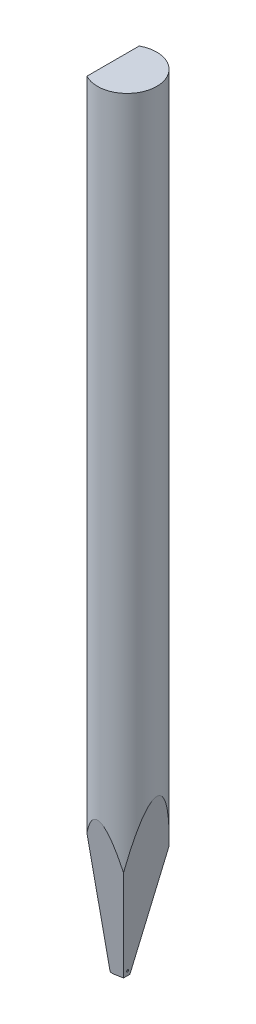
ISO-10303-21;
HEADER;
FILE_DESCRIPTION(('STEP AP214'),'2;1');
FILE_NAME('part.step','',(''),(''),'','','');
FILE_SCHEMA(('AUTOMOTIVE_DESIGN { 1 0 10303 214 1 1 1 1 }'));
ENDSEC;
DATA;
#1=APPLICATION_CONTEXT('core data for automotive mechanical design processes');
#2=APPLICATION_PROTOCOL_DEFINITION('international standard','automotive_design',2000,#1);
#3=PRODUCT_CONTEXT('',#1,'mechanical');
#4=PRODUCT('Part','Part','',(#3));
#5=PRODUCT_RELATED_PRODUCT_CATEGORY('part','',(#4));
#6=PRODUCT_DEFINITION_FORMATION('','',#4);
#7=PRODUCT_DEFINITION_CONTEXT('part definition',#1,'design');
#8=PRODUCT_DEFINITION('design','',#6,#7);
#9=PRODUCT_DEFINITION_SHAPE('','',#8);
#10=(LENGTH_UNIT() NAMED_UNIT(*) SI_UNIT(.MILLI.,.METRE.));
#11=(NAMED_UNIT(*) PLANE_ANGLE_UNIT() SI_UNIT($,.RADIAN.));
#12=(NAMED_UNIT(*) SI_UNIT($,.STERADIAN.) SOLID_ANGLE_UNIT());
#13=UNCERTAINTY_MEASURE_WITH_UNIT(LENGTH_MEASURE(1.E-05),#10,'distance_accuracy_value','');
#14=(GEOMETRIC_REPRESENTATION_CONTEXT(3) GLOBAL_UNCERTAINTY_ASSIGNED_CONTEXT((#13)) GLOBAL_UNIT_ASSIGNED_CONTEXT((#10,
#11,#12)) REPRESENTATION_CONTEXT('',''));
#15=CARTESIAN_POINT('',(0.,0.,0.));
#16=DIRECTION('',(0.,0.,1.));
#17=DIRECTION('',(1.,0.,0.));
#18=AXIS2_PLACEMENT_3D('',#15,#16,#17);
#19=CARTESIAN_POINT('',(-0.29972,0.,27.2760283406468));
#20=DIRECTION('',(-0.173648177666931,0.984807753012208,0.));
#21=DIRECTION('',(-0.984807753012208,-0.173648177666931,0.));
#22=AXIS2_PLACEMENT_3D('',#19,#20,#21);
#23=PLANE('',#22);
#24=DIRECTION('',(-0.984807753012208,-0.173648177666931,0.));
#25=VECTOR('',#24,1.);
#26=CARTESIAN_POINT('',(-0.29972,0.,0.0190499999999996));
#27=LINE('',#26,#25);
#28=CARTESIAN_POINT('',(-0.1397,0.0282158434529687,0.0190499999999998));
#29=VERTEX_POINT('',#28);
#30=CARTESIAN_POINT('',(-0.29972,0.,0.0190499999999998));
#31=VERTEX_POINT('',#30);
#32=EDGE_CURVE('E11',#29,#31,#27,.T.);
#33=ORIENTED_EDGE('',*,*,#32,.F.);
#34=DIRECTION('',(0.,0.,1.));
#35=VECTOR('',#34,1.);
#36=CARTESIAN_POINT('',(-0.1397,0.0282158434529687,27.2760283406468));
#37=LINE('',#36,#35);
#38=CARTESIAN_POINT('',(-0.1397,0.0282158434529687,-0.0190499999999998));
#39=VERTEX_POINT('',#38);
#40=EDGE_CURVE('E51',#39,#29,#37,.T.);
#41=ORIENTED_EDGE('',*,*,#40,.F.);
#42=DIRECTION('',(-0.984807753012208,-0.173648177666931,0.));
#43=VECTOR('',#42,1.);
#44=CARTESIAN_POINT('',(-0.29972,0.,-0.0190499999999996));
#45=LINE('',#44,#43);
#46=CARTESIAN_POINT('',(-0.29972,0.,-0.0190499999999998));
#47=VERTEX_POINT('',#46);
#48=EDGE_CURVE('E151',#39,#47,#45,.T.);
#49=ORIENTED_EDGE('',*,*,#48,.T.);
#50=DIRECTION('',(0.,0.,-1.));
#51=VECTOR('',#50,1.);
#52=CARTESIAN_POINT('',(-0.29972,0.,27.2760283406468));
#53=LINE('',#52,#51);
#54=CARTESIAN_POINT('',(-0.299719999999993,0.,-0.0762000000000001));
#55=VERTEX_POINT('',#54);
#56=EDGE_CURVE('E207',#47,#55,#53,.T.);
#57=ORIENTED_EDGE('',*,*,#56,.T.);
#58=DIRECTION('',(0.984346441568213,0.173566836012845,-0.0306045161452665));
#59=VECTOR('',#58,1.);
#60=CARTESIAN_POINT('',(26.0298035813508,4.64260539659194,-0.894816592201888));
#61=LINE('',#60,#59);
#62=CARTESIAN_POINT('',(-0.0113543651851166,0.0508466417269886,-0.0851656348148851));
#63=VERTEX_POINT('',#62);
#64=EDGE_CURVE('E249',#55,#63,#61,.T.);
#65=ORIENTED_EDGE('',*,*,#64,.T.);
#66=DIRECTION('',(0.,0.,-1.));
#67=VECTOR('',#66,1.);
#68=CARTESIAN_POINT('',(-0.0113543651851151,0.0508466417269888,27.2760283406468));
#69=LINE('',#68,#67);
#70=CARTESIAN_POINT('',(-0.0113543651851166,0.0508466417269886,0.0851656348148851));
#71=VERTEX_POINT('',#70);
#72=EDGE_CURVE('E204',#71,#63,#69,.T.);
#73=ORIENTED_EDGE('',*,*,#72,.F.);
#74=DIRECTION('',(-0.984346441568213,-0.173566836012845,-0.0306045161452665));
#75=VECTOR('',#74,1.);
#76=CARTESIAN_POINT('',(26.0298035813508,4.64260539659194,0.894816592201888));
#77=LINE('',#76,#75);
#78=CARTESIAN_POINT('',(-0.299719999999993,0.,0.0762000000000001));
#79=VERTEX_POINT('',#78);
#80=EDGE_CURVE('E217',#71,#79,#77,.T.);
#81=ORIENTED_EDGE('',*,*,#80,.T.);
#82=EDGE_CURVE('E208',#79,#31,#53,.T.);
#83=ORIENTED_EDGE('',*,*,#82,.T.);
#84=EDGE_LOOP('',(#33,#41,#49,#57,#65,#73,#81,#83));
#85=FACE_BOUND('',#84,.T.);
#86=ADVANCED_FACE('F43',(#85),#23,.F.);
#87=CARTESIAN_POINT('',(0.,0.,0.));
#88=DIRECTION('',(0.,1.,0.));
#89=DIRECTION('',(0.,0.,1.));
#90=AXIS2_PLACEMENT_3D('',#87,#88,#89);
#91=PLANE('',#90);
#92=DIRECTION('',(1.,0.,0.));
#93=VECTOR('',#92,1.);
#94=CARTESIAN_POINT('',(-0.37592,0.,0.00761999999999999));
#95=LINE('',#94,#93);
#96=CARTESIAN_POINT('',(-0.34798,0.,0.00761999999999999));
#97=VERTEX_POINT('',#96);
#98=CARTESIAN_POINT('',(-0.323283579734188,0.,0.00761999999999999));
#99=VERTEX_POINT('',#98);
#100=EDGE_CURVE('E65',#97,#99,#95,.T.);
#101=ORIENTED_EDGE('',*,*,#100,.T.);
#102=CARTESIAN_POINT('',(-0.303122954743875,0.,0.));
#103=DIRECTION('',(0.,1.,0.));
#104=DIRECTION('',(-1.,0.,0.));
#105=AXIS2_PLACEMENT_3D('',#102,#103,#104);
#106=ELLIPSE('',#105,0.0219970452561248,0.01905);
#107=CARTESIAN_POINT('',(-0.303122954743875,0.,0.01905));
#108=VERTEX_POINT('',#107);
#109=EDGE_CURVE('E58',#108,#99,#106,.F.);
#110=ORIENTED_EDGE('',*,*,#109,.F.);
#111=DIRECTION('',(1.,0.,0.));
#112=VECTOR('',#111,1.);
#113=CARTESIAN_POINT('',(-0.1397,0.,0.01905));
#114=LINE('',#113,#112);
#115=EDGE_CURVE('E364',#108,#31,#114,.T.);
#116=ORIENTED_EDGE('',*,*,#115,.T.);
#117=ORIENTED_EDGE('',*,*,#82,.F.);
#118=DIRECTION('',(-1.,0.,0.));
#119=VECTOR('',#118,1.);
#120=CARTESIAN_POINT('',(26.8738719491216,0.,0.0762));
#121=LINE('',#120,#119);
#122=CARTESIAN_POINT('',(-0.34798,0.,0.0761999999999992));
#123=VERTEX_POINT('',#122);
#124=EDGE_CURVE('E220',#79,#123,#121,.T.);
#125=ORIENTED_EDGE('',*,*,#124,.T.);
#126=DIRECTION('',(0.,0.,-1.));
#127=VECTOR('',#126,1.);
#128=CARTESIAN_POINT('',(-0.34798,0.,26.4992219491216));
#129=LINE('',#128,#127);
#130=EDGE_CURVE('E195',#123,#97,#129,.T.);
#131=ORIENTED_EDGE('',*,*,#130,.T.);
#132=EDGE_LOOP('',(#101,#110,#116,#117,#125,#131));
#133=FACE_BOUND('',#132,.T.);
#134=ADVANCED_FACE('F305',(#133),#91,.F.);
#135=CARTESIAN_POINT('',(26.8738719491216,0.,0.0762));
#136=DIRECTION('',(0.,-0.173648177666931,0.984807753012208));
#137=DIRECTION('',(0.,-0.984807753012208,-0.173648177666931));
#138=AXIS2_PLACEMENT_3D('',#135,#136,#137);
#139=PLANE('',#138);
#140=CARTESIAN_POINT('',(-0.34798,0.02794,0.0811265758409938));
#141=DIRECTION('',(0.,-0.173648177666931,0.984807753012208));
#142=DIRECTION('',(0.,-0.984807753012208,-0.173648177666931));
#143=AXIS2_PLACEMENT_3D('',#140,#141,#142);
#144=ELLIPSE('',#143,0.0283710195360877,0.02794);
#145=CARTESIAN_POINT('',(-0.37592,0.02794,0.0811265758409938));
#146=VERTEX_POINT('',#145);
#147=EDGE_CURVE('E198',#123,#146,#144,.F.);
#148=ORIENTED_EDGE('',*,*,#147,.F.);
#149=ORIENTED_EDGE('',*,*,#124,.F.);
#150=ORIENTED_EDGE('',*,*,#80,.F.);
#151=DIRECTION('',(-0.171087869746036,-0.970287525247814,-0.171087869746036));
#152=VECTOR('',#151,1.);
#153=CARTESIAN_POINT('',(0.766901483986011,4.46455489014234,0.863421483986016));
#154=LINE('',#153,#152);
#155=CARTESIAN_POINT('',(0.510025990868476,3.00774157611953,0.606545990868479));
#156=VERTEX_POINT('',#155);
#157=EDGE_CURVE('E214',#156,#71,#154,.T.);
#158=ORIENTED_EDGE('',*,*,#157,.F.);
#159=CARTESIAN_POINT('',(0.,-0.432151674654869,0.));
#160=DIRECTION('',(0.,-0.173648177666931,0.984807753012208));
#161=DIRECTION('',(0.,-0.984807753012208,-0.173648177666931));
#162=AXIS2_PLACEMENT_3D('',#159,#160,#161);
#163=ELLIPSE('',#162,4.56371043248163,0.792479999999998);
#164=CARTESIAN_POINT('',(-0.37592,3.52439037249585,0.69764511322018));
#165=VERTEX_POINT('',#164);
#166=EDGE_CURVE('E226',#156,#165,#163,.T.);
#167=ORIENTED_EDGE('',*,*,#166,.T.);
#168=DIRECTION('',(0.,0.984807753012208,0.173648177666931));
#169=VECTOR('',#168,1.);
#170=CARTESIAN_POINT('',(-0.37592,20.2050421358819,3.63889407490738));
#171=LINE('',#170,#169);
#172=EDGE_CURVE('E241',#146,#165,#171,.T.);
#173=ORIENTED_EDGE('',*,*,#172,.F.);
#174=EDGE_LOOP('',(#148,#149,#150,#158,#167,#173));
#175=FACE_BOUND('',#174,.T.);
#176=ADVANCED_FACE('F311',(#175),#139,.T.);
#177=CARTESIAN_POINT('',(26.8738719491216,0.,-0.0762));
#178=DIRECTION('',(0.,-0.173648177666931,-0.984807753012208));
#179=DIRECTION('',(0.,0.984807753012208,-0.173648177666931));
#180=AXIS2_PLACEMENT_3D('',#177,#178,#179);
#181=PLANE('',#180);
#182=CARTESIAN_POINT('',(-0.34798,0.02794,-0.0811265758409938));
#183=DIRECTION('',(0.,-0.173648177666931,-0.984807753012208));
#184=DIRECTION('',(0.,0.984807753012208,-0.173648177666931));
#185=AXIS2_PLACEMENT_3D('',#182,#183,#184);
#186=ELLIPSE('',#185,0.0283710195360877,0.02794);
#187=CARTESIAN_POINT('',(-0.37592,0.02794,-0.0811265758409938));
#188=VERTEX_POINT('',#187);
#189=CARTESIAN_POINT('',(-0.34798,0.,-0.0761999999999985));
#190=VERTEX_POINT('',#189);
#191=EDGE_CURVE('E252',#188,#190,#186,.F.);
#192=ORIENTED_EDGE('',*,*,#191,.F.);
#193=DIRECTION('',(0.,-0.984807753012208,0.173648177666931));
#194=VECTOR('',#193,1.);
#195=CARTESIAN_POINT('',(-0.37592,20.5629593754693,-3.70200454110734));
#196=LINE('',#195,#194);
#197=CARTESIAN_POINT('',(-0.37592,3.52439037249586,-0.69764511322018));
#198=VERTEX_POINT('',#197);
#199=EDGE_CURVE('E243',#198,#188,#196,.T.);
#200=ORIENTED_EDGE('',*,*,#199,.F.);
#201=CARTESIAN_POINT('',(0.,-0.432151674654869,0.));
#202=DIRECTION('',(0.,-0.173648177666931,-0.984807753012208));
#203=DIRECTION('',(0.,-0.984807753012208,0.173648177666931));
#204=AXIS2_PLACEMENT_3D('',#201,#202,#203);
#205=ELLIPSE('',#204,4.56371043248163,0.792479999999998);
#206=CARTESIAN_POINT('',(0.510025990868476,3.00774157611953,-0.606545990868479));
#207=VERTEX_POINT('',#206);
#208=EDGE_CURVE('E229',#198,#207,#205,.T.);
#209=ORIENTED_EDGE('',*,*,#208,.T.);
#210=DIRECTION('',(0.171087869746036,0.970287525247814,-0.171087869746036));
#211=VECTOR('',#210,1.);
#212=CARTESIAN_POINT('',(0.766901483986011,4.46455489014234,-0.863421483986016));
#213=LINE('',#212,#211);
#214=EDGE_CURVE('E246',#63,#207,#213,.T.);
#215=ORIENTED_EDGE('',*,*,#214,.F.);
#216=ORIENTED_EDGE('',*,*,#64,.F.);
#217=DIRECTION('',(-1.,0.,0.));
#218=VECTOR('',#217,1.);
#219=CARTESIAN_POINT('',(26.8738719491216,0.,-0.0762));
#220=LINE('',#219,#218);
#221=EDGE_CURVE('E223',#55,#190,#220,.T.);
#222=ORIENTED_EDGE('',*,*,#221,.T.);
#223=EDGE_LOOP('',(#192,#200,#209,#215,#216,#222));
#224=FACE_BOUND('',#223,.T.);
#225=ADVANCED_FACE('F319',(#224),#181,.T.);
#226=DIRECTION('',(1.,0.,0.));
#227=VECTOR('',#226,1.);
#228=CARTESIAN_POINT('',(-0.1397,0.,-0.01905));
#229=LINE('',#228,#227);
#230=CARTESIAN_POINT('',(-0.303122954743875,0.,-0.01905));
#231=VERTEX_POINT('',#230);
#232=EDGE_CURVE('E155',#231,#47,#229,.T.);
#233=ORIENTED_EDGE('',*,*,#232,.F.);
#234=CARTESIAN_POINT('',(-0.323283579734188,0.,-0.00761999999999999));
#235=VERTEX_POINT('',#234);
#236=EDGE_CURVE('E188',#235,#231,#106,.F.);
#237=ORIENTED_EDGE('',*,*,#236,.F.);
#238=DIRECTION('',(1.,0.,0.));
#239=VECTOR('',#238,1.);
#240=CARTESIAN_POINT('',(-0.37592,0.,-0.00761999999999999));
#241=LINE('',#240,#239);
#242=CARTESIAN_POINT('',(-0.34798,0.,-0.00761999999999999));
#243=VERTEX_POINT('',#242);
#244=EDGE_CURVE('E191',#235,#243,#241,.F.);
#245=ORIENTED_EDGE('',*,*,#244,.T.);
#246=EDGE_CURVE('E199',#243,#190,#129,.T.);
#247=ORIENTED_EDGE('',*,*,#246,.T.);
#248=ORIENTED_EDGE('',*,*,#221,.F.);
#249=ORIENTED_EDGE('',*,*,#56,.F.);
#250=EDGE_LOOP('',(#233,#237,#245,#247,#248,#249));
#251=FACE_BOUND('',#250,.T.);
#252=ADVANCED_FACE('F313',(#251),#91,.F.);
#253=CARTESIAN_POINT('',(0.,21.0312,0.));
#254=DIRECTION('',(0.,-1.,0.));
#255=DIRECTION('',(0.,0.,-1.));
#256=AXIS2_PLACEMENT_3D('',#253,#254,#255);
#257=CYLINDRICAL_SURFACE('',#256,0.792479999999998);
#258=ORIENTED_EDGE('',*,*,#166,.F.);
#259=CARTESIAN_POINT('',(0.,0.115240446574631,0.));
#260=DIRECTION('',(-0.984807753012208,0.173648177666931,0.));
#261=DIRECTION('',(-0.173648177666931,-0.984807753012208,0.));
#262=AXIS2_PLACEMENT_3D('',#259,#260,#261);
#263=ELLIPSE('',#262,4.56371043248165,0.792479999999998);
#264=EDGE_CURVE('E211',#156,#207,#263,.T.);
#265=ORIENTED_EDGE('',*,*,#264,.T.);
#266=ORIENTED_EDGE('',*,*,#208,.F.);
#267=DIRECTION('',(0.,-1.,0.));
#268=VECTOR('',#267,1.);
#269=CARTESIAN_POINT('',(-0.37592,21.0312,-0.69764511322018));
#270=LINE('',#269,#268);
#271=CARTESIAN_POINT('',(-0.37592,21.0312,-0.69764511322018));
#272=VERTEX_POINT('',#271);
#273=EDGE_CURVE('E235',#272,#198,#270,.T.);
#274=ORIENTED_EDGE('',*,*,#273,.F.);
#275=CARTESIAN_POINT('',(0.,21.0312,0.));
#276=DIRECTION('',(0.,1.,0.));
#277=DIRECTION('',(0.,0.,1.));
#278=AXIS2_PLACEMENT_3D('',#275,#276,#277);
#279=CIRCLE('',#278,0.792479999999998);
#280=CARTESIAN_POINT('',(-0.37592,21.0312,0.69764511322018));
#281=VERTEX_POINT('',#280);
#282=EDGE_CURVE('E238',#281,#272,#279,.T.);
#283=ORIENTED_EDGE('',*,*,#282,.F.);
#284=DIRECTION('',(0.,-1.,0.));
#285=VECTOR('',#284,1.);
#286=CARTESIAN_POINT('',(-0.37592,21.0312,0.69764511322018));
#287=LINE('',#286,#285);
#288=EDGE_CURVE('E233',#165,#281,#287,.F.);
#289=ORIENTED_EDGE('',*,*,#288,.F.);
#290=EDGE_LOOP('',(#258,#265,#266,#274,#283,#289));
#291=FACE_BOUND('',#290,.T.);
#292=ADVANCED_FACE('F45',(#291),#257,.T.);
#293=CARTESIAN_POINT('',(-0.37592,21.0312,-1.04648));
#294=DIRECTION('',(-1.,0.,0.));
#295=DIRECTION('',(0.,0.,1.));
#296=AXIS2_PLACEMENT_3D('',#293,#294,#295);
#297=PLANE('',#296);
#298=DIRECTION('',(0.,0.,-1.));
#299=VECTOR('',#298,1.);
#300=CARTESIAN_POINT('',(-0.37592,0.02794,26.4992219491216));
#301=LINE('',#300,#299);
#302=EDGE_CURVE('E194',#146,#188,#301,.T.);
#303=ORIENTED_EDGE('',*,*,#302,.F.);
#304=ORIENTED_EDGE('',*,*,#172,.T.);
#305=ORIENTED_EDGE('',*,*,#288,.T.);
#306=DIRECTION('',(0.,0.,-1.));
#307=VECTOR('',#306,1.);
#308=CARTESIAN_POINT('',(-0.37592,21.0312,-1.04648));
#309=LINE('',#308,#307);
#310=EDGE_CURVE('E231',#281,#272,#309,.T.);
#311=ORIENTED_EDGE('',*,*,#310,.T.);
#312=ORIENTED_EDGE('',*,*,#273,.T.);
#313=ORIENTED_EDGE('',*,*,#199,.T.);
#314=EDGE_LOOP('',(#303,#304,#305,#311,#312,#313));
#315=FACE_BOUND('',#314,.T.);
#316=ADVANCED_FACE('F324',(#315),#297,.T.);
#317=CARTESIAN_POINT('',(0.,21.0312,0.));
#318=DIRECTION('',(0.,1.,0.));
#319=DIRECTION('',(0.,0.,1.));
#320=AXIS2_PLACEMENT_3D('',#317,#318,#319);
#321=PLANE('',#320);
#322=ORIENTED_EDGE('',*,*,#282,.T.);
#323=ORIENTED_EDGE('',*,*,#310,.F.);
#324=EDGE_LOOP('',(#322,#323));
#325=FACE_BOUND('',#324,.T.);
#326=ADVANCED_FACE('F327',(#325),#321,.T.);
#327=CARTESIAN_POINT('',(-0.0113543651851151,0.0508466417269888,27.2760283406468));
#328=DIRECTION('',(-0.984807753012208,0.173648177666931,0.));
#329=DIRECTION('',(-0.173648177666931,-0.984807753012208,0.));
#330=AXIS2_PLACEMENT_3D('',#327,#328,#329);
#331=PLANE('',#330);
#332=CARTESIAN_POINT('',(0.0122922911853769,0.184953494095707,0.));
#333=DIRECTION('',(-0.984807753012208,0.173648177666931,0.));
#334=DIRECTION('',(0.173648177666931,0.984807753012208,0.));
#335=AXIS2_PLACEMENT_3D('',#332,#333,#334);
#336=ELLIPSE('',#335,0.0336182099567053,0.0252651922242437);
#337=CARTESIAN_POINT('',(0.0181300320807831,0.218060967903463,0.));
#338=VERTEX_POINT('',#337);
#339=EDGE_CURVE('E190',#338,#338,#336,.F.);
#340=ORIENTED_EDGE('',*,*,#339,.F.);
#341=EDGE_LOOP('',(#340));
#342=FACE_BOUND('',#341,.T.);
#343=ORIENTED_EDGE('',*,*,#264,.F.);
#344=ORIENTED_EDGE('',*,*,#157,.T.);
#345=ORIENTED_EDGE('',*,*,#72,.T.);
#346=ORIENTED_EDGE('',*,*,#214,.T.);
#347=EDGE_LOOP('',(#343,#344,#345,#346));
#348=FACE_BOUND('',#347,.T.);
#349=ADVANCED_FACE('F316',(#342,#348),#331,.F.);
#350=CARTESIAN_POINT('',(-0.34798,0.02794,26.4992219491216));
#351=DIRECTION('',(0.,0.,-1.));
#352=DIRECTION('',(-1.,0.,0.));
#353=AXIS2_PLACEMENT_3D('',#350,#351,#352);
#354=CYLINDRICAL_SURFACE('',#353,0.02794);
#355=ORIENTED_EDGE('',*,*,#246,.F.);
#356=CARTESIAN_POINT('',(-0.34798,0.,-0.00761999999999999));
#357=CARTESIAN_POINT('',(-0.349260838526018,-8.81676741679126E-07,-0.00761342797363544));
#358=CARTESIAN_POINT('',(-0.350542651181107,8.80109399203273E-05,-0.00761973223861402));
#359=CARTESIAN_POINT('',(-0.353091697107111,0.000441481724360118,-0.00761108058006404));
#360=CARTESIAN_POINT('',(-0.354358743009661,0.000707402867483912,-0.00759596113467013));
#361=CARTESIAN_POINT('',(-0.356563594814098,0.00133224291421113,-0.00750726784662674));
#362=CARTESIAN_POINT('',(-0.357511647928351,0.00165705227291036,-0.00744752648678852));
#363=CARTESIAN_POINT('',(-0.359358176955209,0.00240254932236018,-0.00724183076857275));
#364=CARTESIAN_POINT('',(-0.360256814463699,0.00282289817001736,-0.00709617826086234));
#365=CARTESIAN_POINT('',(-0.361647035642117,0.00356338971137572,-0.00674263257678659));
#366=CARTESIAN_POINT('',(-0.36216248692183,0.00386008243531898,-0.00658007504728955));
#367=CARTESIAN_POINT('',(-0.363152913998302,0.00447168054117064,-0.00618077626694058));
#368=CARTESIAN_POINT('',(-0.36362794063012,0.0047865621872957,-0.00594412999174184));
#369=CARTESIAN_POINT('',(-0.36440100837745,0.00533125631934878,-0.00545325325198283));
#370=CARTESIAN_POINT('',(-0.364712437418389,0.00556133138664017,-0.00522059373692826));
#371=CARTESIAN_POINT('',(-0.365294657692232,0.00600874064165741,-0.00469863176247799));
#372=CARTESIAN_POINT('',(-0.365565508449751,0.00622609320100179,-0.00440941373493318));
#373=CARTESIAN_POINT('',(-0.366001077119866,0.00658709799158548,-0.00384205009916143));
#374=CARTESIAN_POINT('',(-0.366176037210406,0.00673644801788023,-0.00357544768994291));
#375=CARTESIAN_POINT('',(-0.366487966010279,0.00700816842395334,-0.00300810143220815));
#376=CARTESIAN_POINT('',(-0.36662494987661,0.00713054956348955,-0.00270737127243003));
#377=CARTESIAN_POINT('',(-0.366855777967306,0.00733967600731578,-0.00207490825005269));
#378=CARTESIAN_POINT('',(-0.366949270615374,0.00742613030640138,-0.00174294794692113));
#379=CARTESIAN_POINT('',(-0.367086426436587,0.0075538000350169,-0.00106049413519454));
#380=CARTESIAN_POINT('',(-0.367130126396082,0.00759504886104502,-0.000710014509068715));
#381=CARTESIAN_POINT('',(-0.36716297244411,0.00762602845023061,-5.05594896232522E-05));
#382=CARTESIAN_POINT('',(-0.367158514573197,0.00762179965927629,0.00025783905616071));
#383=CARTESIAN_POINT('',(-0.367110413169975,0.00757650352579383,0.000868739985741704));
#384=CARTESIAN_POINT('',(-0.367066779157589,0.00753544513297569,0.00117124378373552));
#385=CARTESIAN_POINT('',(-0.366944444836,0.00742171533626179,0.0017512641085621));
#386=CARTESIAN_POINT('',(-0.366867026125003,0.0073502014316919,0.00202928470520281));
#387=CARTESIAN_POINT('',(-0.366680419877177,0.00718057483634579,0.00256572792647317));
#388=CARTESIAN_POINT('',(-0.366571227058069,0.00708245772310999,0.00282414728348642));
#389=CARTESIAN_POINT('',(-0.366313416724153,0.00685537643742791,0.00333985970373399));
#390=CARTESIAN_POINT('',(-0.366162121921105,0.0067244217677951,0.00359492535916682));
#391=CARTESIAN_POINT('',(-0.365830860653336,0.00644494059820669,0.00407485267303433));
#392=CARTESIAN_POINT('',(-0.365650876498364,0.00629640327118106,0.0042996955369662));
#393=CARTESIAN_POINT('',(-0.365155645463276,0.0058993491598436,0.0048405407969949));
#394=CARTESIAN_POINT('',(-0.364822357561208,0.00564267903800972,0.00513409148843572));
#395=CARTESIAN_POINT('',(-0.364111087855352,0.0051227301230035,0.00565310316788824));
#396=CARTESIAN_POINT('',(-0.363733000797912,0.00485943695891625,0.00587839919808735));
#397=CARTESIAN_POINT('',(-0.3627211827863,0.00419378520725796,0.00638257057809542));
#398=CARTESIAN_POINT('',(-0.362063516584328,0.00379672766790842,0.00662002246299598));
#399=CARTESIAN_POINT('',(-0.360695924314032,0.00304895365601281,0.00699593307199142));
#400=CARTESIAN_POINT('',(-0.359985854717131,0.00269837241032547,0.00713410788197689));
#401=CARTESIAN_POINT('',(-0.35803235792888,0.00183671193146476,0.00741740876944212));
#402=CARTESIAN_POINT('',(-0.35675644956956,0.00137996474014182,0.00750259160994658));
#403=CARTESIAN_POINT('',(-0.354151325352197,0.000656387211828433,0.00760074826142297));
#404=CARTESIAN_POINT('',(-0.352822082978854,0.000389652608029296,0.0076136856957318));
#405=CARTESIAN_POINT('',(-0.350319842257604,7.35058883095765E-05,0.00761952972801638));
#406=CARTESIAN_POINT('',(-0.349149911638644,-3.36959204219108E-07,0.0076148994060413));
#407=CARTESIAN_POINT('',(-0.347980000000001,0.,0.00762000000001181));
#408=B_SPLINE_CURVE_WITH_KNOTS('',3,(#356,#357,#358,#359,#360,#361,#362,#363,#364,#365,#366,
#367,#368,#369,#370,#371,#372,#373,#374,#375,#376,#377,#378,#379,#380,#381,#382,#383,#384,#385,
#386,#387,#388,#389,#390,#391,#392,#393,#394,#395,#396,#397,#398,#399,#400,#401,#402,#403,#404,
#405,#406,#407),.UNSPECIFIED.,.F.,.F.,(4,2,2,2,2,2,2,2,2,2,2,2,2,2,2,2,2,2,2,2,2,2,2,2,2,4),(0.,
0.00384139255229719,0.00771226393644116,0.0107172432604901,0.0137117268939721,
0.0155570531669648,0.0174000235036578,0.0187508478593238,0.0200996708584894,0.0211519737138444,
0.0222038559694947,0.0232640997240131,0.0243235596719399,0.0252442446600319,0.0261647059793443,
0.0270529312046893,0.0279413041772911,0.0289102408945831,0.0298797773994969,0.0314098525374115,
0.0329435965900662,0.0353421920520842,0.0377476200427738,0.0417990474925838,0.0458525147140497,
0.0493600621258075),.UNSPECIFIED.);
#409=EDGE_CURVE('E255',#243,#97,#408,.T.);
#410=ORIENTED_EDGE('',*,*,#409,.T.);
#411=ORIENTED_EDGE('',*,*,#130,.F.);
#412=ORIENTED_EDGE('',*,*,#147,.T.);
#413=ORIENTED_EDGE('',*,*,#302,.T.);
#414=ORIENTED_EDGE('',*,*,#191,.T.);
#415=EDGE_LOOP('',(#355,#410,#411,#412,#413,#414));
#416=FACE_BOUND('',#415,.T.);
#417=ADVANCED_FACE('F270',(#416),#354,.T.);
#418=CARTESIAN_POINT('',(-0.37592,0.,0.));
#419=DIRECTION('',(1.,0.,0.));
#420=DIRECTION('',(0.,0.,-1.));
#421=AXIS2_PLACEMENT_3D('',#418,#419,#420);
#422=CYLINDRICAL_SURFACE('',#421,0.00761999999999999);
#423=ORIENTED_EDGE('',*,*,#244,.F.);
#424=CARTESIAN_POINT('',(-0.323283579734188,0.,-0.00761999999999999));
#425=CARTESIAN_POINT('',(-0.323053864026116,0.000396478513984933,-0.0076203599074515));
#426=CARTESIAN_POINT('',(-0.322836489167605,0.000801347529707628,-0.0075890208025004));
#427=CARTESIAN_POINT('',(-0.322431312366638,0.00161640952700105,-0.00745797373094153));
#428=CARTESIAN_POINT('',(-0.322243615354712,0.00202661608304388,-0.00735802957027683));
#429=CARTESIAN_POINT('',(-0.321903524444027,0.00283995570276055,-0.00708406484579287));
#430=CARTESIAN_POINT('',(-0.321751307488617,0.00324304442101094,-0.0069096847868343));
#431=CARTESIAN_POINT('',(-0.321485011493499,0.00402139648475693,-0.00648753519016993));
#432=CARTESIAN_POINT('',(-0.321370845490212,0.00439672173206697,-0.00623993547299766));
#433=CARTESIAN_POINT('',(-0.321185958055623,0.00507074818085823,-0.00570268758235462));
#434=CARTESIAN_POINT('',(-0.32111223538704,0.00537331157393492,-0.00541889008079869));
#435=CARTESIAN_POINT('',(-0.320988683484326,0.00593047484408739,-0.00480275424138956));
#436=CARTESIAN_POINT('',(-0.320938869840054,0.00618504336064701,-0.00447038441571599));
#437=CARTESIAN_POINT('',(-0.320858461906053,0.00663333393339102,-0.00377260330546654));
#438=CARTESIAN_POINT('',(-0.320827568087666,0.00682797862192928,-0.00340781762806912));
#439=CARTESIAN_POINT('',(-0.320779003804923,0.00715591589197775,-0.00265091938727883));
#440=CARTESIAN_POINT('',(-0.320761331325077,0.00728921782352226,-0.00225881099898755));
#441=CARTESIAN_POINT('',(-0.320735436523949,0.00749264175990874,-0.0014498674004991));
#442=CARTESIAN_POINT('',(-0.320727410219521,0.00756144721852378,-0.00103269454647182));
#443=CARTESIAN_POINT('',(-0.320719499580249,0.00762921615827924,-0.000192599778032899));
#444=CARTESIAN_POINT('',(-0.320719616311992,0.00762817049022236,0.000230322882243018));
#445=CARTESIAN_POINT('',(-0.320728062093733,0.00755591292362511,0.00107398769975052));
#446=CARTESIAN_POINT('',(-0.320736466622365,0.00748405613803131,0.00149467407879903));
#447=CARTESIAN_POINT('',(-0.320763676040055,0.00727134733491305,0.00231789308137806));
#448=CARTESIAN_POINT('',(-0.320782480950598,0.00713049517486226,0.00272042566740574));
#449=CARTESIAN_POINT('',(-0.320834346911214,0.00678456149784976,0.00349478145066946));
#450=CARTESIAN_POINT('',(-0.320867374357635,0.00657963168811534,0.00386667458771193));
#451=CARTESIAN_POINT('',(-0.320952882865039,0.00611220546386626,0.0045698454132322));
#452=CARTESIAN_POINT('',(-0.321005361731826,0.00584971554371954,0.00490112767716773));
#453=CARTESIAN_POINT('',(-0.321134322030223,0.00528116084361023,0.00550854260450881));
#454=CARTESIAN_POINT('',(-0.32121041153997,0.00497584922653601,0.00578546319977447));
#455=CARTESIAN_POINT('',(-0.321391197829367,0.00433025961097364,0.00628325414646762));
#456=CARTESIAN_POINT('',(-0.321495881417541,0.00398999778132999,0.00650415025360329));
#457=CARTESIAN_POINT('',(-0.321734268477098,0.00329248483612839,0.00688327202389737));
#458=CARTESIAN_POINT('',(-0.321867543718291,0.00293553945236784,0.00704233431166694));
#459=CARTESIAN_POINT('',(-0.32216330171539,0.00221231093944459,0.0073019062501655));
#460=CARTESIAN_POINT('',(-0.322325807573232,0.00184602062259769,0.0074023693195733));
#461=CARTESIAN_POINT('',(-0.322620812800038,0.00123109677737418,0.00752420831386235));
#462=CARTESIAN_POINT('',(-0.32274649543126,0.00098197222340363,0.00756055916527291));
#463=CARTESIAN_POINT('',(-0.32300785009182,0.000487690129840846,0.00760841230735642));
#464=CARTESIAN_POINT('',(-0.323143485536232,0.000242521740632095,0.00762000130916931));
#465=CARTESIAN_POINT('',(-0.323283579733135,8.67613361005767E-13,0.00762000000694806));
#466=B_SPLINE_CURVE_WITH_KNOTS('',3,(#424,#425,#426,#427,#428,#429,#430,#431,#432,#433,#434,
#435,#436,#437,#438,#439,#440,#441,#442,#443,#444,#445,#446,#447,#448,#449,#450,#451,#452,#453,
#454,#455,#456,#457,#458,#459,#460,#461,#462,#463,#464,#465),.UNSPECIFIED.,.F.,.F.,(4,2,2,2,2,2,
2,2,2,2,2,2,2,2,2,2,2,2,2,2,4),(0.,0.00137499281841696,0.00275474337375781,0.00414123432954453,
0.00552453444507195,0.00678236923485227,0.00804102308422552,0.00927919748573883,
0.0105171830986908,0.0117799216824226,0.013042825661727,0.0143173383878938,0.0155918537468803,
0.0168633741836683,0.0181347512316305,0.0193860613063953,0.0206367950789798,0.0218699624587794,
0.0231041087689918,0.0239470519345969,0.0247870384077606),.UNSPECIFIED.);
#467=EDGE_CURVE('E263',#235,#99,#466,.T.);
#468=ORIENTED_EDGE('',*,*,#467,.T.);
#469=ORIENTED_EDGE('',*,*,#100,.F.);
#470=ORIENTED_EDGE('',*,*,#409,.F.);
#471=EDGE_LOOP('',(#423,#468,#469,#470));
#472=FACE_BOUND('',#471,.T.);
#473=ADVANCED_FACE('F273',(#472),#422,.F.);
#474=CARTESIAN_POINT('',(-0.1397,0.09144,0.01905));
#475=DIRECTION('',(-1.,0.,0.));
#476=DIRECTION('',(0.,-1.,0.));
#477=AXIS2_PLACEMENT_3D('',#474,#475,#476);
#478=PLANE('',#477);
#479=ORIENTED_EDGE('',*,*,#40,.T.);
#480=DIRECTION('',(0.,1.,0.));
#481=VECTOR('',#480,1.);
#482=CARTESIAN_POINT('',(-0.1397,0.09144,0.01905));
#483=LINE('',#482,#481);
#484=CARTESIAN_POINT('',(-0.1397,0.09144,0.01905));
#485=VERTEX_POINT('',#484);
#486=EDGE_CURVE('E162',#29,#485,#483,.T.);
#487=ORIENTED_EDGE('',*,*,#486,.T.);
#488=CARTESIAN_POINT('',(-0.1397,0.0914400000000001,0.));
#489=DIRECTION('',(-1.,0.,0.));
#490=DIRECTION('',(0.,1.,0.));
#491=AXIS2_PLACEMENT_3D('',#488,#489,#490);
#492=ELLIPSE('',#491,0.0219970452561247,0.01905);
#493=CARTESIAN_POINT('',(-0.1397,0.09144,-0.01905));
#494=VERTEX_POINT('',#493);
#495=EDGE_CURVE('E158',#485,#494,#492,.F.);
#496=ORIENTED_EDGE('',*,*,#495,.T.);
#497=DIRECTION('',(0.,1.,0.));
#498=VECTOR('',#497,1.);
#499=CARTESIAN_POINT('',(-0.1397,0.09144,-0.01905));
#500=LINE('',#499,#498);
#501=EDGE_CURVE('E144',#39,#494,#500,.T.);
#502=ORIENTED_EDGE('',*,*,#501,.F.);
#503=EDGE_LOOP('',(#479,#487,#496,#502));
#504=FACE_BOUND('',#503,.T.);
#505=ADVANCED_FACE('F160',(#504),#478,.T.);
#506=CARTESIAN_POINT('',(0.,0.,0.01905));
#507=DIRECTION('',(0.,0.,-1.));
#508=DIRECTION('',(-1.,0.,0.));
#509=AXIS2_PLACEMENT_3D('',#506,#507,#508);
#510=PLANE('',#509);
#511=ORIENTED_EDGE('',*,*,#32,.T.);
#512=ORIENTED_EDGE('',*,*,#115,.F.);
#513=DIRECTION('',(-0.500000000000004,-0.866025403784436,0.));
#514=VECTOR('',#513,1.);
#515=CARTESIAN_POINT('',(-0.227342216057905,0.131256089639199,0.01905));
#516=LINE('',#515,#514);
#517=CARTESIAN_POINT('',(-0.250330046129175,0.09144,0.01905));
#518=VERTEX_POINT('',#517);
#519=EDGE_CURVE('E183',#518,#108,#516,.T.);
#520=ORIENTED_EDGE('',*,*,#519,.F.);
#521=DIRECTION('',(-1.,0.,0.));
#522=VECTOR('',#521,1.);
#523=CARTESIAN_POINT('',(-0.2723270913853,0.09144,0.01905));
#524=LINE('',#523,#522);
#525=EDGE_CURVE('E154',#485,#518,#524,.T.);
#526=ORIENTED_EDGE('',*,*,#525,.F.);
#527=ORIENTED_EDGE('',*,*,#486,.F.);
#528=EDGE_LOOP('',(#511,#512,#520,#526,#527));
#529=FACE_BOUND('',#528,.T.);
#530=ADVANCED_FACE('F289',(#529),#510,.T.);
#531=CARTESIAN_POINT('',(0.,0.,-0.01905));
#532=DIRECTION('',(0.,0.,-1.));
#533=DIRECTION('',(-1.,0.,0.));
#534=AXIS2_PLACEMENT_3D('',#531,#532,#533);
#535=PLANE('',#534);
#536=ORIENTED_EDGE('',*,*,#501,.T.);
#537=DIRECTION('',(-1.,0.,0.));
#538=VECTOR('',#537,1.);
#539=CARTESIAN_POINT('',(-0.2723270913853,0.09144,-0.01905));
#540=LINE('',#539,#538);
#541=CARTESIAN_POINT('',(-0.250330046129175,0.09144,-0.01905));
#542=VERTEX_POINT('',#541);
#543=EDGE_CURVE('E149',#494,#542,#540,.T.);
#544=ORIENTED_EDGE('',*,*,#543,.T.);
#545=DIRECTION('',(0.500000000000004,0.866025403784436,0.));
#546=VECTOR('',#545,1.);
#547=CARTESIAN_POINT('',(-0.250330046129175,0.09144,-0.01905));
#548=LINE('',#547,#546);
#549=EDGE_CURVE('E185',#231,#542,#548,.T.);
#550=ORIENTED_EDGE('',*,*,#549,.F.);
#551=ORIENTED_EDGE('',*,*,#232,.T.);
#552=ORIENTED_EDGE('',*,*,#48,.F.);
#553=EDGE_LOOP('',(#536,#544,#550,#551,#552));
#554=FACE_BOUND('',#553,.T.);
#555=ADVANCED_FACE('F146',(#554),#535,.F.);
#556=CARTESIAN_POINT('',(-0.0103574919504674,0.166115931840058,0.));
#557=DIRECTION('',(0.866025403784441,0.499999999999995,0.));
#558=DIRECTION('',(-0.499999999999995,0.866025403784441,0.));
#559=AXIS2_PLACEMENT_3D('',#556,#557,#558);
#560=CONICAL_SURFACE('',#559,0.01905,0.226892802759263);
#561=CARTESIAN_POINT('',(-0.0103574919504674,0.166115931840058,0.));
#562=DIRECTION('',(0.866025403784441,0.499999999999995,0.));
#563=DIRECTION('',(-0.499999999999995,0.866025403784441,0.));
#564=AXIS2_PLACEMENT_3D('',#561,#562,#563);
#565=CIRCLE('',#564,0.01905);
#566=CARTESIAN_POINT('',(-0.0198824919504673,0.182613715782152,0.));
#567=VERTEX_POINT('',#566);
#568=EDGE_CURVE('E166',#567,#567,#565,.T.);
#569=ORIENTED_EDGE('',*,*,#568,.F.);
#570=EDGE_LOOP('',(#569));
#571=FACE_BOUND('',#570,.T.);
#572=ORIENTED_EDGE('',*,*,#339,.T.);
#573=EDGE_LOOP('',(#572));
#574=FACE_BOUND('',#573,.T.);
#575=ADVANCED_FACE('F284',(#571,#574),#560,.F.);
#576=CARTESIAN_POINT('',(-0.250330046129175,0.09144,0.));
#577=DIRECTION('',(-0.500000000000004,-0.866025403784436,0.));
#578=DIRECTION('',(0.866025403784436,-0.500000000000004,0.));
#579=AXIS2_PLACEMENT_3D('',#576,#577,#578);
#580=CYLINDRICAL_SURFACE('',#579,0.01905);
#581=ORIENTED_EDGE('',*,*,#236,.T.);
#582=ORIENTED_EDGE('',*,*,#549,.T.);
#583=CARTESIAN_POINT('',(-0.250330046129175,0.09144,0.));
#584=DIRECTION('',(0.,-1.,0.));
#585=DIRECTION('',(-1.,0.,0.));
#586=AXIS2_PLACEMENT_3D('',#583,#584,#585);
#587=ELLIPSE('',#586,0.0219970452561248,0.01905);
#588=EDGE_CURVE('E174',#542,#518,#587,.F.);
#589=ORIENTED_EDGE('',*,*,#588,.T.);
#590=ORIENTED_EDGE('',*,*,#519,.T.);
#591=ORIENTED_EDGE('',*,*,#109,.T.);
#592=ORIENTED_EDGE('',*,*,#467,.F.);
#593=EDGE_LOOP('',(#581,#582,#589,#590,#591,#592));
#594=FACE_BOUND('',#593,.T.);
#595=ADVANCED_FACE('F277',(#594),#580,.F.);
#596=CARTESIAN_POINT('',(-0.2723270913853,0.09144,0.01905));
#597=DIRECTION('',(0.,-1.,0.));
#598=DIRECTION('',(0.,0.,-1.));
#599=AXIS2_PLACEMENT_3D('',#596,#597,#598);
#600=PLANE('',#599);
#601=ORIENTED_EDGE('',*,*,#543,.F.);
#602=CARTESIAN_POINT('',(-0.1397,0.09144,0.));
#603=DIRECTION('',(0.,-1.,0.));
#604=DIRECTION('',(1.,0.,0.));
#605=AXIS2_PLACEMENT_3D('',#602,#603,#604);
#606=ELLIPSE('',#605,0.0381000000000004,0.01905);
#607=EDGE_CURVE('E167',#494,#485,#606,.F.);
#608=ORIENTED_EDGE('',*,*,#607,.T.);
#609=ORIENTED_EDGE('',*,*,#525,.T.);
#610=ORIENTED_EDGE('',*,*,#588,.F.);
#611=EDGE_LOOP('',(#601,#608,#609,#610));
#612=FACE_BOUND('',#611,.T.);
#613=ADVANCED_FACE('F173',(#612),#600,.T.);
#614=CARTESIAN_POINT('',(-0.320091732268594,-0.0127092151848543,0.));
#615=DIRECTION('',(0.866025403784441,0.499999999999995,0.));
#616=DIRECTION('',(-0.499999999999995,0.866025403784441,0.));
#617=AXIS2_PLACEMENT_3D('',#614,#615,#616);
#618=CYLINDRICAL_SURFACE('',#617,0.01905);
#619=ORIENTED_EDGE('',*,*,#568,.T.);
#620=EDGE_LOOP('',(#619));
#621=FACE_BOUND('',#620,.T.);
#622=ORIENTED_EDGE('',*,*,#495,.F.);
#623=ORIENTED_EDGE('',*,*,#607,.F.);
#624=EDGE_LOOP('',(#622,#623));
#625=FACE_BOUND('',#624,.T.);
#626=ADVANCED_FACE('F169',(#621,#625),#618,.F.);
#627=CLOSED_SHELL('',(#86,#134,#176,#225,#252,#292,#316,#326,#349,#417,#473,#505,#530,#555,#575,
#595,#613,#626));
#628=MANIFOLD_SOLID_BREP('B2',#627);
#629=ADVANCED_BREP_SHAPE_REPRESENTATION('',(#18,#628),#14);
#630=SHAPE_DEFINITION_REPRESENTATION(#9,#629);
ENDSEC;
END-ISO-10303-21;
